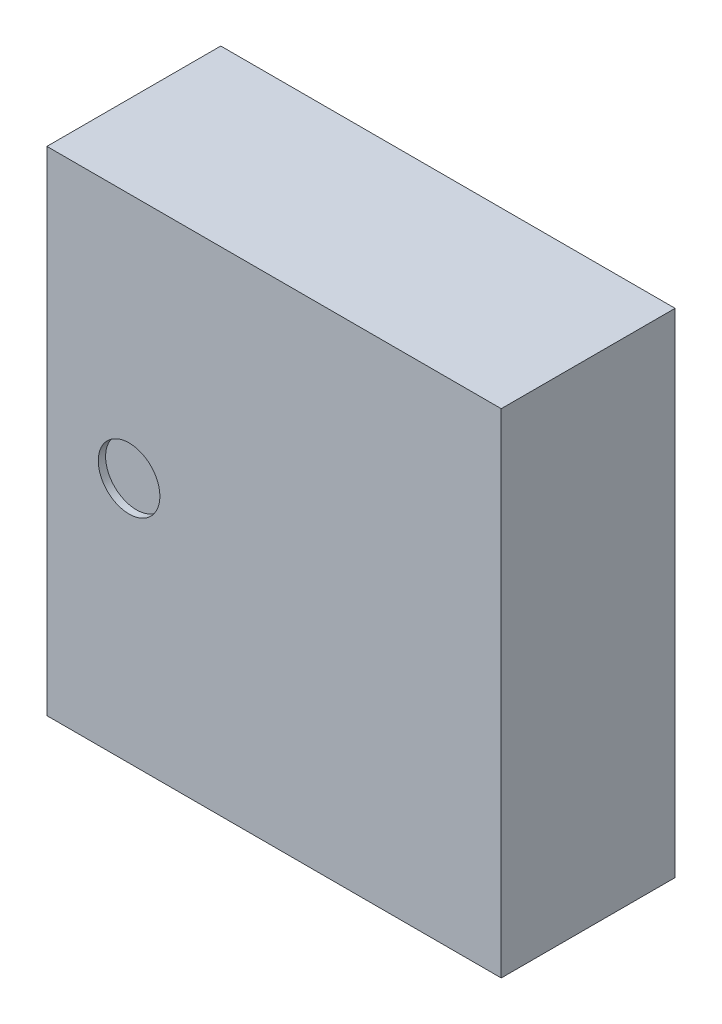
ISO-10303-21;
HEADER;
FILE_DESCRIPTION(('STEP AP214'),'2;1');
FILE_NAME('part.step','',(''),(''),'','','');
FILE_SCHEMA(('AUTOMOTIVE_DESIGN { 1 0 10303 214 1 1 1 1 }'));
ENDSEC;
DATA;
#1=APPLICATION_CONTEXT('core data for automotive mechanical design processes');
#2=APPLICATION_PROTOCOL_DEFINITION('international standard','automotive_design',2000,#1);
#3=PRODUCT_CONTEXT('',#1,'mechanical');
#4=PRODUCT('Part','Part','',(#3));
#5=PRODUCT_RELATED_PRODUCT_CATEGORY('part','',(#4));
#6=PRODUCT_DEFINITION_FORMATION('','',#4);
#7=PRODUCT_DEFINITION_CONTEXT('part definition',#1,'design');
#8=PRODUCT_DEFINITION('design','',#6,#7);
#9=PRODUCT_DEFINITION_SHAPE('','',#8);
#10=(LENGTH_UNIT() NAMED_UNIT(*) SI_UNIT(.MILLI.,.METRE.));
#11=(NAMED_UNIT(*) PLANE_ANGLE_UNIT() SI_UNIT($,.RADIAN.));
#12=(NAMED_UNIT(*) SI_UNIT($,.STERADIAN.) SOLID_ANGLE_UNIT());
#13=UNCERTAINTY_MEASURE_WITH_UNIT(LENGTH_MEASURE(1.E-05),#10,'distance_accuracy_value','');
#14=(GEOMETRIC_REPRESENTATION_CONTEXT(3) GLOBAL_UNCERTAINTY_ASSIGNED_CONTEXT((#13)) GLOBAL_UNIT_ASSIGNED_CONTEXT((#10,
#11,#12)) REPRESENTATION_CONTEXT('',''));
#15=CARTESIAN_POINT('',(0.,0.,0.));
#16=DIRECTION('',(0.,0.,1.));
#17=DIRECTION('',(1.,0.,0.));
#18=AXIS2_PLACEMENT_3D('',#15,#16,#17);
#19=CARTESIAN_POINT('',(1.125,3.375,2.41));
#20=DIRECTION('',(0.,0.,1.));
#21=DIRECTION('',(1.,0.,0.));
#22=AXIS2_PLACEMENT_3D('',#19,#20,#21);
#23=PLANE('',#22);
#24=CARTESIAN_POINT('',(1.125,3.375,2.41));
#25=DIRECTION('',(0.,0.,1.));
#26=DIRECTION('',(1.,0.,0.));
#27=AXIS2_PLACEMENT_3D('',#24,#25,#26);
#28=CIRCLE('',#27,0.421875);
#29=CARTESIAN_POINT('',(1.546875,3.375,2.41));
#30=VERTEX_POINT('',#29);
#31=EDGE_CURVE('E20',#30,#30,#28,.T.);
#32=ORIENTED_EDGE('',*,*,#31,.T.);
#33=EDGE_LOOP('',(#32));
#34=FACE_BOUND('',#33,.T.);
#35=ADVANCED_FACE('F17',(#34),#23,.T.);
#36=CARTESIAN_POINT('',(1.125,3.375,2.41));
#37=DIRECTION('',(0.,0.,1.));
#38=DIRECTION('',(1.,0.,0.));
#39=AXIS2_PLACEMENT_3D('',#36,#37,#38);
#40=CYLINDRICAL_SURFACE('',#39,0.421875);
#41=CARTESIAN_POINT('',(1.125,3.375,2.51));
#42=DIRECTION('',(0.,0.,1.));
#43=DIRECTION('',(1.,0.,0.));
#44=AXIS2_PLACEMENT_3D('',#41,#42,#43);
#45=CIRCLE('',#44,0.421875);
#46=CARTESIAN_POINT('',(1.546875,3.375,2.51));
#47=VERTEX_POINT('',#46);
#48=EDGE_CURVE('E66',#47,#47,#45,.F.);
#49=ORIENTED_EDGE('',*,*,#48,.F.);
#50=EDGE_LOOP('',(#49));
#51=FACE_BOUND('',#50,.T.);
#52=ORIENTED_EDGE('',*,*,#31,.F.);
#53=EDGE_LOOP('',(#52));
#54=FACE_BOUND('',#53,.T.);
#55=ADVANCED_FACE('F87',(#51,#54),#40,.F.);
#56=CARTESIAN_POINT('',(0.,0.,2.51));
#57=DIRECTION('',(0.,0.,1.));
#58=DIRECTION('',(1.,0.,0.));
#59=AXIS2_PLACEMENT_3D('',#56,#57,#58);
#60=PLANE('',#59);
#61=ORIENTED_EDGE('',*,*,#48,.T.);
#62=EDGE_LOOP('',(#61));
#63=FACE_BOUND('',#62,.T.);
#64=DIRECTION('',(0.,1.,0.));
#65=VECTOR('',#64,1.);
#66=CARTESIAN_POINT('',(6.22,0.,2.51));
#67=LINE('',#66,#65);
#68=CARTESIAN_POINT('',(6.22,6.75,2.51));
#69=VERTEX_POINT('',#68);
#70=CARTESIAN_POINT('',(6.22,0.,2.51));
#71=VERTEX_POINT('',#70);
#72=EDGE_CURVE('E166',#69,#71,#67,.F.);
#73=ORIENTED_EDGE('',*,*,#72,.F.);
#74=DIRECTION('',(1.,0.,0.));
#75=VECTOR('',#74,1.);
#76=CARTESIAN_POINT('',(0.,6.75,2.51));
#77=LINE('',#76,#75);
#78=CARTESIAN_POINT('',(0.,6.75,2.51));
#79=VERTEX_POINT('',#78);
#80=EDGE_CURVE('E60',#79,#69,#77,.T.);
#81=ORIENTED_EDGE('',*,*,#80,.F.);
#82=DIRECTION('',(0.,1.,0.));
#83=VECTOR('',#82,1.);
#84=CARTESIAN_POINT('',(0.,0.,2.51));
#85=LINE('',#84,#83);
#86=CARTESIAN_POINT('',(0.,0.,2.51));
#87=VERTEX_POINT('',#86);
#88=EDGE_CURVE('E58',#79,#87,#85,.F.);
#89=ORIENTED_EDGE('',*,*,#88,.T.);
#90=DIRECTION('',(1.,0.,0.));
#91=VECTOR('',#90,1.);
#92=CARTESIAN_POINT('',(0.,0.,2.51));
#93=LINE('',#92,#91);
#94=EDGE_CURVE('E55',#87,#71,#93,.T.);
#95=ORIENTED_EDGE('',*,*,#94,.T.);
#96=EDGE_LOOP('',(#73,#81,#89,#95));
#97=FACE_BOUND('',#96,.T.);
#98=ADVANCED_FACE('F59',(#63,#97),#60,.T.);
#99=CARTESIAN_POINT('',(0.,0.,0.13));
#100=DIRECTION('',(1.,0.,0.));
#101=DIRECTION('',(0.,0.,-1.));
#102=AXIS2_PLACEMENT_3D('',#99,#100,#101);
#103=PLANE('',#102);
#104=DIRECTION('',(0.,0.,1.));
#105=VECTOR('',#104,1.);
#106=CARTESIAN_POINT('',(0.,6.75,0.13));
#107=LINE('',#106,#105);
#108=CARTESIAN_POINT('',(0.,6.75,0.13));
#109=VERTEX_POINT('',#108);
#110=EDGE_CURVE('E170',#109,#79,#107,.T.);
#111=ORIENTED_EDGE('',*,*,#110,.F.);
#112=DIRECTION('',(0.,1.,0.));
#113=VECTOR('',#112,1.);
#114=CARTESIAN_POINT('',(0.,0.,0.13));
#115=LINE('',#114,#113);
#116=CARTESIAN_POINT('',(0.,0.,0.13));
#117=VERTEX_POINT('',#116);
#118=EDGE_CURVE('E77',#109,#117,#115,.F.);
#119=ORIENTED_EDGE('',*,*,#118,.T.);
#120=DIRECTION('',(0.,0.,1.));
#121=VECTOR('',#120,1.);
#122=CARTESIAN_POINT('',(0.,0.,0.13));
#123=LINE('',#122,#121);
#124=EDGE_CURVE('E65',#117,#87,#123,.T.);
#125=ORIENTED_EDGE('',*,*,#124,.T.);
#126=ORIENTED_EDGE('',*,*,#88,.F.);
#127=EDGE_LOOP('',(#111,#119,#125,#126));
#128=FACE_BOUND('',#127,.T.);
#129=ADVANCED_FACE('F76',(#128),#103,.F.);
#130=CARTESIAN_POINT('',(0.,0.,0.13));
#131=DIRECTION('',(0.,1.,0.));
#132=DIRECTION('',(0.,0.,1.));
#133=AXIS2_PLACEMENT_3D('',#130,#131,#132);
#134=PLANE('',#133);
#135=ORIENTED_EDGE('',*,*,#94,.F.);
#136=ORIENTED_EDGE('',*,*,#124,.F.);
#137=DIRECTION('',(1.,0.,0.));
#138=VECTOR('',#137,1.);
#139=CARTESIAN_POINT('',(0.,0.,0.13));
#140=LINE('',#139,#138);
#141=CARTESIAN_POINT('',(6.22,0.,0.13));
#142=VERTEX_POINT('',#141);
#143=EDGE_CURVE('E168',#117,#142,#140,.T.);
#144=ORIENTED_EDGE('',*,*,#143,.T.);
#145=DIRECTION('',(0.,0.,-1.));
#146=VECTOR('',#145,1.);
#147=CARTESIAN_POINT('',(6.22,0.,0.13));
#148=LINE('',#147,#146);
#149=EDGE_CURVE('E73',#71,#142,#148,.T.);
#150=ORIENTED_EDGE('',*,*,#149,.F.);
#151=EDGE_LOOP('',(#135,#136,#144,#150));
#152=FACE_BOUND('',#151,.T.);
#153=ADVANCED_FACE('F70',(#152),#134,.F.);
#154=CARTESIAN_POINT('',(6.22,0.,0.13));
#155=DIRECTION('',(1.,0.,0.));
#156=DIRECTION('',(0.,0.,-1.));
#157=AXIS2_PLACEMENT_3D('',#154,#155,#156);
#158=PLANE('',#157);
#159=DIRECTION('',(0.,0.,1.));
#160=VECTOR('',#159,1.);
#161=CARTESIAN_POINT('',(6.22,6.75,0.13));
#162=LINE('',#161,#160);
#163=CARTESIAN_POINT('',(6.22,6.75,0.13));
#164=VERTEX_POINT('',#163);
#165=EDGE_CURVE('E34',#69,#164,#162,.F.);
#166=ORIENTED_EDGE('',*,*,#165,.F.);
#167=ORIENTED_EDGE('',*,*,#72,.T.);
#168=ORIENTED_EDGE('',*,*,#149,.T.);
#169=DIRECTION('',(0.,1.,0.));
#170=VECTOR('',#169,1.);
#171=CARTESIAN_POINT('',(6.22,0.,0.13));
#172=LINE('',#171,#170);
#173=EDGE_CURVE('E26',#142,#164,#172,.T.);
#174=ORIENTED_EDGE('',*,*,#173,.T.);
#175=EDGE_LOOP('',(#166,#167,#168,#174));
#176=FACE_BOUND('',#175,.T.);
#177=ADVANCED_FACE('F104',(#176),#158,.T.);
#178=CARTESIAN_POINT('',(0.,6.75,0.13));
#179=DIRECTION('',(0.,1.,0.));
#180=DIRECTION('',(0.,0.,1.));
#181=AXIS2_PLACEMENT_3D('',#178,#179,#180);
#182=PLANE('',#181);
#183=ORIENTED_EDGE('',*,*,#80,.T.);
#184=ORIENTED_EDGE('',*,*,#165,.T.);
#185=DIRECTION('',(1.,0.,0.));
#186=VECTOR('',#185,1.);
#187=CARTESIAN_POINT('',(0.,6.75,0.13));
#188=LINE('',#187,#186);
#189=EDGE_CURVE('E11',#164,#109,#188,.F.);
#190=ORIENTED_EDGE('',*,*,#189,.T.);
#191=ORIENTED_EDGE('',*,*,#110,.T.);
#192=EDGE_LOOP('',(#183,#184,#190,#191));
#193=FACE_BOUND('',#192,.T.);
#194=ADVANCED_FACE('F98',(#193),#182,.T.);
#195=CARTESIAN_POINT('',(0.,0.,0.13));
#196=DIRECTION('',(0.,0.,1.));
#197=DIRECTION('',(1.,0.,0.));
#198=AXIS2_PLACEMENT_3D('',#195,#196,#197);
#199=PLANE('',#198);
#200=ORIENTED_EDGE('',*,*,#173,.F.);
#201=ORIENTED_EDGE('',*,*,#143,.F.);
#202=ORIENTED_EDGE('',*,*,#118,.F.);
#203=ORIENTED_EDGE('',*,*,#189,.F.);
#204=EDGE_LOOP('',(#200,#201,#202,#203));
#205=FACE_BOUND('',#204,.T.);
#206=ADVANCED_FACE('F96',(#205),#199,.F.);
#207=CLOSED_SHELL('',(#35,#55,#98,#129,#153,#177,#194,#206));
#208=MANIFOLD_SOLID_BREP('B1',#207);
#209=ADVANCED_BREP_SHAPE_REPRESENTATION('',(#18,#208),#14);
#210=SHAPE_DEFINITION_REPRESENTATION(#9,#209);
ENDSEC;
END-ISO-10303-21;
